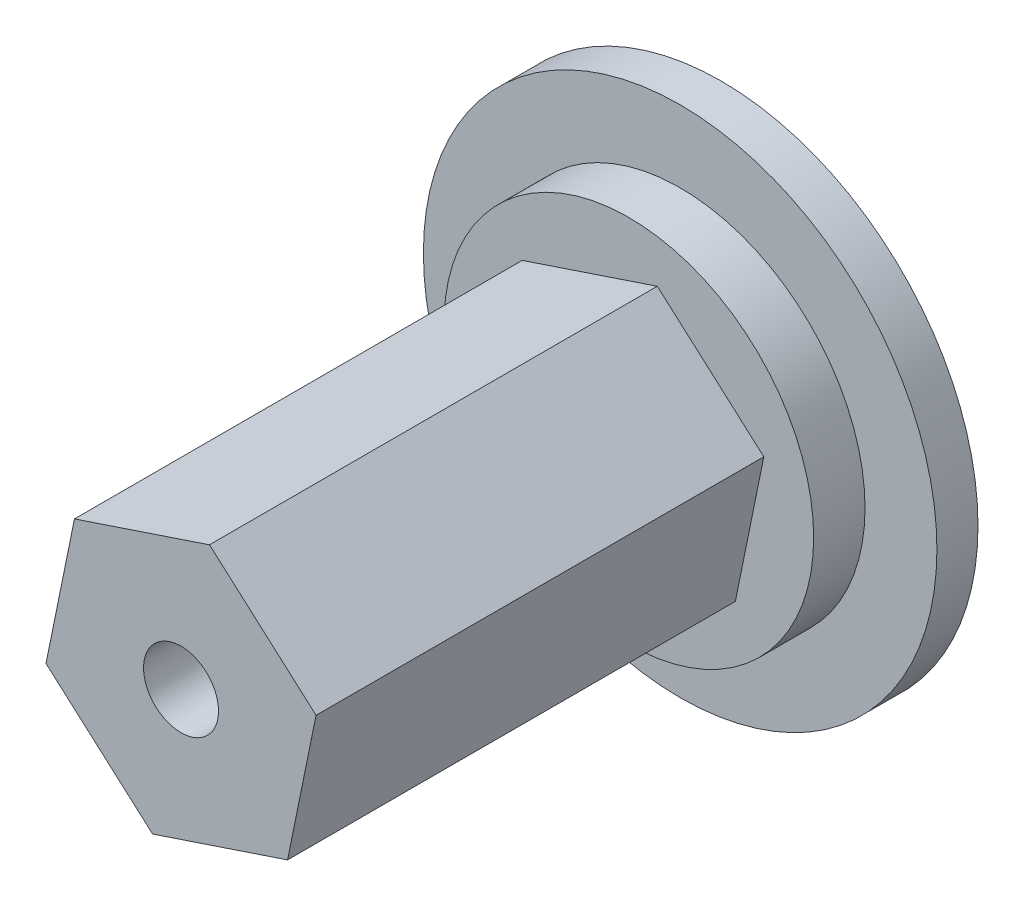
ISO-10303-21;
HEADER;
FILE_DESCRIPTION(('STEP AP214'),'2;1');
FILE_NAME('part.step','',(''),(''),'','','');
FILE_SCHEMA(('AUTOMOTIVE_DESIGN { 1 0 10303 214 1 1 1 1 }'));
ENDSEC;
DATA;
#1=APPLICATION_CONTEXT('core data for automotive mechanical design processes');
#2=APPLICATION_PROTOCOL_DEFINITION('international standard','automotive_design',2000,#1);
#3=PRODUCT_CONTEXT('',#1,'mechanical');
#4=PRODUCT('Part','Part','',(#3));
#5=PRODUCT_RELATED_PRODUCT_CATEGORY('part','',(#4));
#6=PRODUCT_DEFINITION_FORMATION('','',#4);
#7=PRODUCT_DEFINITION_CONTEXT('part definition',#1,'design');
#8=PRODUCT_DEFINITION('design','',#6,#7);
#9=PRODUCT_DEFINITION_SHAPE('','',#8);
#10=(LENGTH_UNIT() NAMED_UNIT(*) SI_UNIT(.MILLI.,.METRE.));
#11=(NAMED_UNIT(*) PLANE_ANGLE_UNIT() SI_UNIT($,.RADIAN.));
#12=(NAMED_UNIT(*) SI_UNIT($,.STERADIAN.) SOLID_ANGLE_UNIT());
#13=UNCERTAINTY_MEASURE_WITH_UNIT(LENGTH_MEASURE(1.E-05),#10,'distance_accuracy_value','');
#14=(GEOMETRIC_REPRESENTATION_CONTEXT(3) GLOBAL_UNCERTAINTY_ASSIGNED_CONTEXT((#13)) GLOBAL_UNIT_ASSIGNED_CONTEXT((#10,
#11,#12)) REPRESENTATION_CONTEXT('',''));
#15=CARTESIAN_POINT('',(0.,0.,0.));
#16=DIRECTION('',(0.,0.,1.));
#17=DIRECTION('',(1.,0.,0.));
#18=AXIS2_PLACEMENT_3D('',#15,#16,#17);
#19=CARTESIAN_POINT('',(0.,0.,0.));
#20=DIRECTION('',(0.,0.,1.));
#21=DIRECTION('',(1.,0.,0.));
#22=AXIS2_PLACEMENT_3D('',#19,#20,#21);
#23=CYLINDRICAL_SURFACE('',#22,1.825);
#24=CARTESIAN_POINT('',(0.,0.,26.3));
#25=DIRECTION('',(0.,0.,1.));
#26=DIRECTION('',(1.,0.,0.));
#27=AXIS2_PLACEMENT_3D('',#24,#25,#26);
#28=CIRCLE('',#27,1.825);
#29=CARTESIAN_POINT('',(1.825,0.,26.3));
#30=VERTEX_POINT('',#29);
#31=EDGE_CURVE('E263',#30,#30,#28,.T.);
#32=ORIENTED_EDGE('',*,*,#31,.T.);
#33=EDGE_LOOP('',(#32));
#34=FACE_BOUND('',#33,.T.);
#35=CARTESIAN_POINT('',(0.,0.,2.));
#36=DIRECTION('',(0.,0.,-1.));
#37=DIRECTION('',(-1.,0.,0.));
#38=AXIS2_PLACEMENT_3D('',#35,#36,#37);
#39=CIRCLE('',#38,1.825);
#40=CARTESIAN_POINT('',(-1.825,0.,2.));
#41=VERTEX_POINT('',#40);
#42=EDGE_CURVE('E47',#41,#41,#39,.F.);
#43=ORIENTED_EDGE('',*,*,#42,.F.);
#44=EDGE_LOOP('',(#43));
#45=FACE_BOUND('',#44,.T.);
#46=ADVANCED_FACE('F43',(#34,#45),#23,.F.);
#47=CARTESIAN_POINT('',(0.,0.,2.));
#48=DIRECTION('',(0.,0.,-1.));
#49=DIRECTION('',(-1.,0.,0.));
#50=AXIS2_PLACEMENT_3D('',#47,#48,#49);
#51=CYLINDRICAL_SURFACE('',#50,12.5);
#52=CARTESIAN_POINT('',(0.,0.,2.));
#53=DIRECTION('',(0.,0.,1.));
#54=DIRECTION('',(1.,0.,0.));
#55=AXIS2_PLACEMENT_3D('',#52,#53,#54);
#56=CIRCLE('',#55,12.5);
#57=CARTESIAN_POINT('',(12.5,0.,2.));
#58=VERTEX_POINT('',#57);
#59=EDGE_CURVE('E52',#58,#58,#56,.T.);
#60=ORIENTED_EDGE('',*,*,#59,.F.);
#61=EDGE_LOOP('',(#60));
#62=FACE_BOUND('',#61,.T.);
#63=CARTESIAN_POINT('',(0.,0.,0.));
#64=DIRECTION('',(0.,0.,1.));
#65=DIRECTION('',(1.,0.,0.));
#66=AXIS2_PLACEMENT_3D('',#63,#64,#65);
#67=CIRCLE('',#66,12.5);
#68=CARTESIAN_POINT('',(12.5,0.,0.));
#69=VERTEX_POINT('',#68);
#70=EDGE_CURVE('E121',#69,#69,#67,.T.);
#71=ORIENTED_EDGE('',*,*,#70,.T.);
#72=EDGE_LOOP('',(#71));
#73=FACE_BOUND('',#72,.T.);
#74=ADVANCED_FACE('F45',(#62,#73),#51,.T.);
#75=CARTESIAN_POINT('',(0.,0.,2.));
#76=DIRECTION('',(0.,0.,1.));
#77=DIRECTION('',(1.,0.,0.));
#78=AXIS2_PLACEMENT_3D('',#75,#76,#77);
#79=PLANE('',#78);
#80=CARTESIAN_POINT('',(0.,0.,2.));
#81=DIRECTION('',(0.,0.,1.));
#82=DIRECTION('',(1.,0.,0.));
#83=AXIS2_PLACEMENT_3D('',#80,#81,#82);
#84=CIRCLE('',#83,9.);
#85=CARTESIAN_POINT('',(9.,0.,2.));
#86=VERTEX_POINT('',#85);
#87=EDGE_CURVE('E11',#86,#86,#84,.T.);
#88=ORIENTED_EDGE('',*,*,#87,.F.);
#89=EDGE_LOOP('',(#88));
#90=FACE_BOUND('',#89,.T.);
#91=ORIENTED_EDGE('',*,*,#59,.T.);
#92=EDGE_LOOP('',(#91));
#93=FACE_BOUND('',#92,.T.);
#94=ADVANCED_FACE('F135',(#90,#93),#79,.T.);
#95=CARTESIAN_POINT('',(0.,0.,0.));
#96=DIRECTION('',(0.,0.,1.));
#97=DIRECTION('',(1.,0.,0.));
#98=AXIS2_PLACEMENT_3D('',#95,#96,#97);
#99=PLANE('',#98);
#100=CARTESIAN_POINT('',(0.,0.,0.));
#101=DIRECTION('',(0.,0.,-1.));
#102=DIRECTION('',(-1.,0.,0.));
#103=AXIS2_PLACEMENT_3D('',#100,#101,#102);
#104=CIRCLE('',#103,6.25);
#105=CARTESIAN_POINT('',(-6.25,0.,0.));
#106=VERTEX_POINT('',#105);
#107=EDGE_CURVE('E259',#106,#106,#104,.T.);
#108=ORIENTED_EDGE('',*,*,#107,.F.);
#109=EDGE_LOOP('',(#108));
#110=FACE_BOUND('',#109,.T.);
#111=ORIENTED_EDGE('',*,*,#70,.F.);
#112=EDGE_LOOP('',(#111));
#113=FACE_BOUND('',#112,.T.);
#114=ADVANCED_FACE('F132',(#110,#113),#99,.F.);
#115=CARTESIAN_POINT('',(0.,0.,4.5));
#116=DIRECTION('',(0.,0.,-1.));
#117=DIRECTION('',(-1.,0.,0.));
#118=AXIS2_PLACEMENT_3D('',#115,#116,#117);
#119=CYLINDRICAL_SURFACE('',#118,9.);
#120=CARTESIAN_POINT('',(0.,0.,4.5));
#121=DIRECTION('',(0.,0.,1.));
#122=DIRECTION('',(1.,0.,0.));
#123=AXIS2_PLACEMENT_3D('',#120,#121,#122);
#124=CIRCLE('',#123,9.);
#125=CARTESIAN_POINT('',(9.,0.,4.5));
#126=VERTEX_POINT('',#125);
#127=EDGE_CURVE('E118',#126,#126,#124,.T.);
#128=ORIENTED_EDGE('',*,*,#127,.F.);
#129=EDGE_LOOP('',(#128));
#130=FACE_BOUND('',#129,.T.);
#131=ORIENTED_EDGE('',*,*,#87,.T.);
#132=EDGE_LOOP('',(#131));
#133=FACE_BOUND('',#132,.T.);
#134=ADVANCED_FACE('F134',(#130,#133),#119,.T.);
#135=CARTESIAN_POINT('',(0.,0.,4.5));
#136=DIRECTION('',(0.,0.,1.));
#137=DIRECTION('',(1.,0.,0.));
#138=AXIS2_PLACEMENT_3D('',#135,#136,#137);
#139=PLANE('',#138);
#140=DIRECTION('',(0.948519421378505,0.316718972067961,0.));
#141=VECTOR('',#140,1.);
#142=CARTESIAN_POINT('',(-1.38581313267407,-6.79002370844963,4.5));
#143=LINE('',#142,#141);
#144=CARTESIAN_POINT('',(-1.38581313267407,-6.79002370844963,4.5));
#145=VERTEX_POINT('',#144);
#146=CARTESIAN_POINT('',(5.18742645747897,-4.59516123201866,4.5));
#147=VERTEX_POINT('',#146);
#148=EDGE_CURVE('E60',#145,#147,#143,.T.);
#149=ORIENTED_EDGE('',*,*,#148,.F.);
#150=DIRECTION('',(0.748546386360601,-0.663082428862722,0.));
#151=VECTOR('',#150,1.);
#152=CARTESIAN_POINT('',(-6.57323959015304,-2.19486247643097,4.5));
#153=LINE('',#152,#151);
#154=CARTESIAN_POINT('',(-6.57323959015304,-2.19486247643097,4.5));
#155=VERTEX_POINT('',#154);
#156=EDGE_CURVE('E64',#155,#145,#153,.T.);
#157=ORIENTED_EDGE('',*,*,#156,.F.);
#158=DIRECTION('',(-0.199973035017904,-0.979801400930682,0.));
#159=VECTOR('',#158,1.);
#160=CARTESIAN_POINT('',(-5.18742645747896,4.59516123201866,4.5));
#161=LINE('',#160,#159);
#162=CARTESIAN_POINT('',(-5.18742645747896,4.59516123201866,4.5));
#163=VERTEX_POINT('',#162);
#164=EDGE_CURVE('E281',#163,#155,#161,.T.);
#165=ORIENTED_EDGE('',*,*,#164,.F.);
#166=DIRECTION('',(-0.948519421378505,-0.316718972067961,0.));
#167=VECTOR('',#166,1.);
#168=CARTESIAN_POINT('',(1.38581313267408,6.79002370844963,4.5));
#169=LINE('',#168,#167);
#170=CARTESIAN_POINT('',(1.38581313267408,6.79002370844963,4.5));
#171=VERTEX_POINT('',#170);
#172=EDGE_CURVE('E278',#171,#163,#169,.T.);
#173=ORIENTED_EDGE('',*,*,#172,.F.);
#174=DIRECTION('',(-0.748546386360601,0.663082428862722,0.));
#175=VECTOR('',#174,1.);
#176=CARTESIAN_POINT('',(6.57323959015304,2.19486247643097,4.5));
#177=LINE('',#176,#175);
#178=CARTESIAN_POINT('',(6.57323959015304,2.19486247643097,4.5));
#179=VERTEX_POINT('',#178);
#180=EDGE_CURVE('E275',#179,#171,#177,.T.);
#181=ORIENTED_EDGE('',*,*,#180,.F.);
#182=DIRECTION('',(0.199973035017904,0.979801400930683,0.));
#183=VECTOR('',#182,1.);
#184=CARTESIAN_POINT('',(5.18742645747897,-4.59516123201866,4.5));
#185=LINE('',#184,#183);
#186=EDGE_CURVE('E273',#147,#179,#185,.T.);
#187=ORIENTED_EDGE('',*,*,#186,.F.);
#188=EDGE_LOOP('',(#149,#157,#165,#173,#181,#187));
#189=FACE_BOUND('',#188,.T.);
#190=ORIENTED_EDGE('',*,*,#127,.T.);
#191=EDGE_LOOP('',(#190));
#192=FACE_BOUND('',#191,.T.);
#193=ADVANCED_FACE('F142',(#189,#192),#139,.T.);
#194=CARTESIAN_POINT('',(-1.38581313267407,-6.79002370844963,26.3));
#195=DIRECTION('',(-0.316718972067961,0.948519421378505,0.));
#196=DIRECTION('',(-0.948519421378505,-0.316718972067961,0.));
#197=AXIS2_PLACEMENT_3D('',#194,#195,#196);
#198=PLANE('',#197);
#199=ORIENTED_EDGE('',*,*,#148,.T.);
#200=DIRECTION('',(0.,0.,-1.));
#201=VECTOR('',#200,1.);
#202=CARTESIAN_POINT('',(5.18742645747897,-4.59516123201866,26.3));
#203=LINE('',#202,#201);
#204=CARTESIAN_POINT('',(5.18742645747897,-4.59516123201866,26.3));
#205=VERTEX_POINT('',#204);
#206=EDGE_CURVE('E101',#205,#147,#203,.T.);
#207=ORIENTED_EDGE('',*,*,#206,.F.);
#208=DIRECTION('',(0.948519421378505,0.316718972067961,0.));
#209=VECTOR('',#208,1.);
#210=CARTESIAN_POINT('',(-1.38581313267407,-6.79002370844963,26.3));
#211=LINE('',#210,#209);
#212=CARTESIAN_POINT('',(-1.38581313267407,-6.79002370844963,26.3));
#213=VERTEX_POINT('',#212);
#214=EDGE_CURVE('E107',#213,#205,#211,.T.);
#215=ORIENTED_EDGE('',*,*,#214,.F.);
#216=DIRECTION('',(0.,0.,-1.));
#217=VECTOR('',#216,1.);
#218=CARTESIAN_POINT('',(-1.38581313267407,-6.79002370844963,26.3));
#219=LINE('',#218,#217);
#220=EDGE_CURVE('E271',#213,#145,#219,.T.);
#221=ORIENTED_EDGE('',*,*,#220,.T.);
#222=EDGE_LOOP('',(#199,#207,#215,#221));
#223=FACE_BOUND('',#222,.T.);
#224=ADVANCED_FACE('F117',(#223),#198,.F.);
#225=CARTESIAN_POINT('',(5.18742645747897,-4.59516123201866,26.3));
#226=DIRECTION('',(-0.979801400930683,0.199973035017904,0.));
#227=DIRECTION('',(-0.199973035017904,-0.979801400930683,0.));
#228=AXIS2_PLACEMENT_3D('',#225,#226,#227);
#229=PLANE('',#228);
#230=ORIENTED_EDGE('',*,*,#186,.T.);
#231=DIRECTION('',(0.,0.,-1.));
#232=VECTOR('',#231,1.);
#233=CARTESIAN_POINT('',(6.57323959015304,2.19486247643097,26.3));
#234=LINE('',#233,#232);
#235=CARTESIAN_POINT('',(6.57323959015304,2.19486247643097,26.3));
#236=VERTEX_POINT('',#235);
#237=EDGE_CURVE('E103',#236,#179,#234,.T.);
#238=ORIENTED_EDGE('',*,*,#237,.F.);
#239=DIRECTION('',(0.199973035017904,0.979801400930683,0.));
#240=VECTOR('',#239,1.);
#241=CARTESIAN_POINT('',(5.18742645747897,-4.59516123201866,26.3));
#242=LINE('',#241,#240);
#243=EDGE_CURVE('E96',#205,#236,#242,.T.);
#244=ORIENTED_EDGE('',*,*,#243,.F.);
#245=ORIENTED_EDGE('',*,*,#206,.T.);
#246=EDGE_LOOP('',(#230,#238,#244,#245));
#247=FACE_BOUND('',#246,.T.);
#248=ADVANCED_FACE('F99',(#247),#229,.F.);
#249=CARTESIAN_POINT('',(6.57323959015304,2.19486247643097,26.3));
#250=DIRECTION('',(-0.663082428862721,-0.748546386360601,0.));
#251=DIRECTION('',(0.748546386360601,-0.663082428862721,0.));
#252=AXIS2_PLACEMENT_3D('',#249,#250,#251);
#253=PLANE('',#252);
#254=ORIENTED_EDGE('',*,*,#180,.T.);
#255=DIRECTION('',(0.,0.,-1.));
#256=VECTOR('',#255,1.);
#257=CARTESIAN_POINT('',(1.38581313267408,6.79002370844963,26.3));
#258=LINE('',#257,#256);
#259=CARTESIAN_POINT('',(1.38581313267408,6.79002370844963,26.3));
#260=VERTEX_POINT('',#259);
#261=EDGE_CURVE('E123',#260,#171,#258,.T.);
#262=ORIENTED_EDGE('',*,*,#261,.F.);
#263=DIRECTION('',(-0.748546386360601,0.663082428862722,0.));
#264=VECTOR('',#263,1.);
#265=CARTESIAN_POINT('',(6.57323959015304,2.19486247643097,26.3));
#266=LINE('',#265,#264);
#267=EDGE_CURVE('E106',#236,#260,#266,.T.);
#268=ORIENTED_EDGE('',*,*,#267,.F.);
#269=ORIENTED_EDGE('',*,*,#237,.T.);
#270=EDGE_LOOP('',(#254,#262,#268,#269));
#271=FACE_BOUND('',#270,.T.);
#272=ADVANCED_FACE('F176',(#271),#253,.F.);
#273=CARTESIAN_POINT('',(1.38581313267408,6.79002370844963,26.3));
#274=DIRECTION('',(0.316718972067961,-0.948519421378505,0.));
#275=DIRECTION('',(0.948519421378505,0.316718972067961,0.));
#276=AXIS2_PLACEMENT_3D('',#273,#274,#275);
#277=PLANE('',#276);
#278=ORIENTED_EDGE('',*,*,#172,.T.);
#279=DIRECTION('',(0.,0.,-1.));
#280=VECTOR('',#279,1.);
#281=CARTESIAN_POINT('',(-5.18742645747896,4.59516123201866,26.3));
#282=LINE('',#281,#280);
#283=CARTESIAN_POINT('',(-5.18742645747896,4.59516123201866,26.3));
#284=VERTEX_POINT('',#283);
#285=EDGE_CURVE('E288',#284,#163,#282,.T.);
#286=ORIENTED_EDGE('',*,*,#285,.F.);
#287=DIRECTION('',(-0.948519421378505,-0.316718972067961,0.));
#288=VECTOR('',#287,1.);
#289=CARTESIAN_POINT('',(1.38581313267408,6.79002370844963,26.3));
#290=LINE('',#289,#288);
#291=EDGE_CURVE('E266',#260,#284,#290,.T.);
#292=ORIENTED_EDGE('',*,*,#291,.F.);
#293=ORIENTED_EDGE('',*,*,#261,.T.);
#294=EDGE_LOOP('',(#278,#286,#292,#293));
#295=FACE_BOUND('',#294,.T.);
#296=ADVANCED_FACE('F172',(#295),#277,.F.);
#297=CARTESIAN_POINT('',(-5.18742645747896,4.59516123201866,26.3));
#298=DIRECTION('',(0.979801400930683,-0.199973035017904,0.));
#299=DIRECTION('',(0.199973035017904,0.979801400930683,0.));
#300=AXIS2_PLACEMENT_3D('',#297,#298,#299);
#301=PLANE('',#300);
#302=ORIENTED_EDGE('',*,*,#164,.T.);
#303=DIRECTION('',(0.,0.,-1.));
#304=VECTOR('',#303,1.);
#305=CARTESIAN_POINT('',(-6.57323959015304,-2.19486247643097,26.3));
#306=LINE('',#305,#304);
#307=CARTESIAN_POINT('',(-6.57323959015304,-2.19486247643097,26.3));
#308=VERTEX_POINT('',#307);
#309=EDGE_CURVE('E285',#308,#155,#306,.T.);
#310=ORIENTED_EDGE('',*,*,#309,.F.);
#311=DIRECTION('',(-0.199973035017904,-0.979801400930682,0.));
#312=VECTOR('',#311,1.);
#313=CARTESIAN_POINT('',(-5.18742645747896,4.59516123201866,26.3));
#314=LINE('',#313,#312);
#315=EDGE_CURVE('E268',#284,#308,#314,.T.);
#316=ORIENTED_EDGE('',*,*,#315,.F.);
#317=ORIENTED_EDGE('',*,*,#285,.T.);
#318=EDGE_LOOP('',(#302,#310,#316,#317));
#319=FACE_BOUND('',#318,.T.);
#320=ADVANCED_FACE('F168',(#319),#301,.F.);
#321=CARTESIAN_POINT('',(-6.57323959015304,-2.19486247643097,26.3));
#322=DIRECTION('',(0.663082428862722,0.748546386360601,0.));
#323=DIRECTION('',(-0.748546386360601,0.663082428862722,0.));
#324=AXIS2_PLACEMENT_3D('',#321,#322,#323);
#325=PLANE('',#324);
#326=ORIENTED_EDGE('',*,*,#156,.T.);
#327=ORIENTED_EDGE('',*,*,#220,.F.);
#328=DIRECTION('',(0.748546386360601,-0.663082428862722,0.));
#329=VECTOR('',#328,1.);
#330=CARTESIAN_POINT('',(-6.57323959015304,-2.19486247643097,26.3));
#331=LINE('',#330,#329);
#332=EDGE_CURVE('E112',#308,#213,#331,.T.);
#333=ORIENTED_EDGE('',*,*,#332,.F.);
#334=ORIENTED_EDGE('',*,*,#309,.T.);
#335=EDGE_LOOP('',(#326,#327,#333,#334));
#336=FACE_BOUND('',#335,.T.);
#337=ADVANCED_FACE('F164',(#336),#325,.F.);
#338=CARTESIAN_POINT('',(0.,0.,26.3));
#339=DIRECTION('',(0.,0.,1.));
#340=DIRECTION('',(1.,0.,0.));
#341=AXIS2_PLACEMENT_3D('',#338,#339,#340);
#342=PLANE('',#341);
#343=ORIENTED_EDGE('',*,*,#31,.F.);
#344=EDGE_LOOP('',(#343));
#345=FACE_BOUND('',#344,.T.);
#346=ORIENTED_EDGE('',*,*,#214,.T.);
#347=ORIENTED_EDGE('',*,*,#243,.T.);
#348=ORIENTED_EDGE('',*,*,#267,.T.);
#349=ORIENTED_EDGE('',*,*,#291,.T.);
#350=ORIENTED_EDGE('',*,*,#315,.T.);
#351=ORIENTED_EDGE('',*,*,#332,.T.);
#352=EDGE_LOOP('',(#346,#347,#348,#349,#350,#351));
#353=FACE_BOUND('',#352,.T.);
#354=ADVANCED_FACE('F110',(#345,#353),#342,.T.);
#355=CARTESIAN_POINT('',(0.,0.,2.));
#356=DIRECTION('',(0.,0.,-1.));
#357=DIRECTION('',(-1.,0.,0.));
#358=AXIS2_PLACEMENT_3D('',#355,#356,#357);
#359=PLANE('',#358);
#360=CARTESIAN_POINT('',(0.,0.,2.));
#361=DIRECTION('',(0.,0.,-1.));
#362=DIRECTION('',(-1.,0.,0.));
#363=AXIS2_PLACEMENT_3D('',#360,#361,#362);
#364=CIRCLE('',#363,6.25);
#365=CARTESIAN_POINT('',(-6.25,0.,2.));
#366=VERTEX_POINT('',#365);
#367=EDGE_CURVE('E257',#366,#366,#364,.T.);
#368=ORIENTED_EDGE('',*,*,#367,.T.);
#369=EDGE_LOOP('',(#368));
#370=FACE_BOUND('',#369,.T.);
#371=ORIENTED_EDGE('',*,*,#42,.T.);
#372=EDGE_LOOP('',(#371));
#373=FACE_BOUND('',#372,.T.);
#374=ADVANCED_FACE('F163',(#370,#373),#359,.T.);
#375=CARTESIAN_POINT('',(0.,0.,2.));
#376=DIRECTION('',(0.,0.,-1.));
#377=DIRECTION('',(-1.,0.,0.));
#378=AXIS2_PLACEMENT_3D('',#375,#376,#377);
#379=CYLINDRICAL_SURFACE('',#378,6.25);
#380=ORIENTED_EDGE('',*,*,#367,.F.);
#381=EDGE_LOOP('',(#380));
#382=FACE_BOUND('',#381,.T.);
#383=ORIENTED_EDGE('',*,*,#107,.T.);
#384=EDGE_LOOP('',(#383));
#385=FACE_BOUND('',#384,.T.);
#386=ADVANCED_FACE('F160',(#382,#385),#379,.F.);
#387=CLOSED_SHELL('',(#46,#74,#94,#114,#134,#193,#224,#248,#272,#296,#320,#337,#354,#374,#386));
#388=MANIFOLD_SOLID_BREP('B2',#387);
#389=ADVANCED_BREP_SHAPE_REPRESENTATION('',(#18,#388),#14);
#390=SHAPE_DEFINITION_REPRESENTATION(#9,#389);
ENDSEC;
END-ISO-10303-21;
